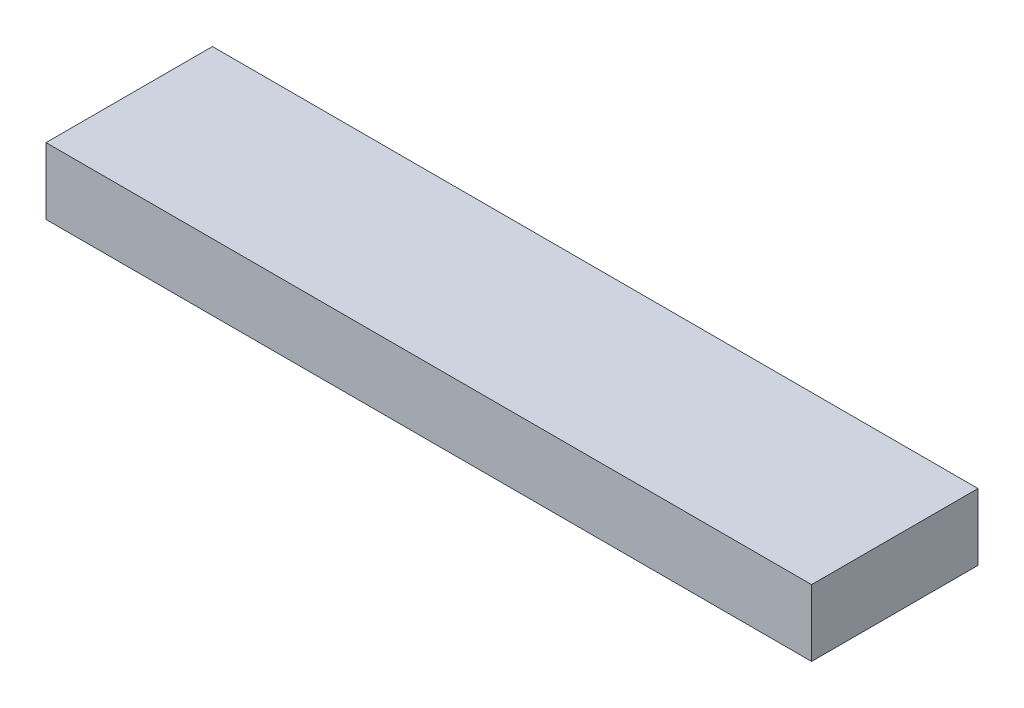
ISO-10303-21;
HEADER;
FILE_DESCRIPTION(('STEP AP214'),'2;1');
FILE_NAME('part.step','',(''),(''),'','','');
FILE_SCHEMA(('AUTOMOTIVE_DESIGN { 1 0 10303 214 1 1 1 1 }'));
ENDSEC;
DATA;
#1=APPLICATION_CONTEXT('core data for automotive mechanical design processes');
#2=APPLICATION_PROTOCOL_DEFINITION('international standard','automotive_design',2000,#1);
#3=PRODUCT_CONTEXT('',#1,'mechanical');
#4=PRODUCT('Part','Part','',(#3));
#5=PRODUCT_RELATED_PRODUCT_CATEGORY('part','',(#4));
#6=PRODUCT_DEFINITION_FORMATION('','',#4);
#7=PRODUCT_DEFINITION_CONTEXT('part definition',#1,'design');
#8=PRODUCT_DEFINITION('design','',#6,#7);
#9=PRODUCT_DEFINITION_SHAPE('','',#8);
#10=(LENGTH_UNIT() NAMED_UNIT(*) SI_UNIT(.MILLI.,.METRE.));
#11=(NAMED_UNIT(*) PLANE_ANGLE_UNIT() SI_UNIT($,.RADIAN.));
#12=(NAMED_UNIT(*) SI_UNIT($,.STERADIAN.) SOLID_ANGLE_UNIT());
#13=UNCERTAINTY_MEASURE_WITH_UNIT(LENGTH_MEASURE(1.E-05),#10,'distance_accuracy_value','');
#14=(GEOMETRIC_REPRESENTATION_CONTEXT(3) GLOBAL_UNCERTAINTY_ASSIGNED_CONTEXT((#13)) GLOBAL_UNIT_ASSIGNED_CONTEXT((#10,
#11,#12)) REPRESENTATION_CONTEXT('',''));
#15=CARTESIAN_POINT('',(0.,0.,0.));
#16=DIRECTION('',(0.,0.,1.));
#17=DIRECTION('',(1.,0.,0.));
#18=AXIS2_PLACEMENT_3D('',#15,#16,#17);
#19=CARTESIAN_POINT('',(0.,0.,31.75));
#20=DIRECTION('',(1.,0.,0.));
#21=DIRECTION('',(0.,1.,0.));
#22=AXIS2_PLACEMENT_3D('',#19,#20,#21);
#23=PLANE('',#22);
#24=DIRECTION('',(0.,-1.,0.));
#25=VECTOR('',#24,1.);
#26=CARTESIAN_POINT('',(0.,0.,0.));
#27=LINE('',#26,#25);
#28=CARTESIAN_POINT('',(0.,0.,0.));
#29=VERTEX_POINT('',#28);
#30=CARTESIAN_POINT('',(0.,-12.7,0.));
#31=VERTEX_POINT('',#30);
#32=EDGE_CURVE('E97',#29,#31,#27,.T.);
#33=ORIENTED_EDGE('',*,*,#32,.T.);
#34=DIRECTION('',(0.,0.,-1.));
#35=VECTOR('',#34,1.);
#36=CARTESIAN_POINT('',(0.,-12.7,31.75));
#37=LINE('',#36,#35);
#38=CARTESIAN_POINT('',(0.,-12.7,31.75));
#39=VERTEX_POINT('',#38);
#40=EDGE_CURVE('E11',#39,#31,#37,.T.);
#41=ORIENTED_EDGE('',*,*,#40,.F.);
#42=DIRECTION('',(0.,-1.,0.));
#43=VECTOR('',#42,1.);
#44=CARTESIAN_POINT('',(0.,0.,31.75));
#45=LINE('',#44,#43);
#46=CARTESIAN_POINT('',(0.,0.,31.75));
#47=VERTEX_POINT('',#46);
#48=EDGE_CURVE('E85',#47,#39,#45,.T.);
#49=ORIENTED_EDGE('',*,*,#48,.F.);
#50=DIRECTION('',(0.,0.,-1.));
#51=VECTOR('',#50,1.);
#52=CARTESIAN_POINT('',(0.,0.,31.75));
#53=LINE('',#52,#51);
#54=EDGE_CURVE('E93',#47,#29,#53,.T.);
#55=ORIENTED_EDGE('',*,*,#54,.T.);
#56=EDGE_LOOP('',(#33,#41,#49,#55));
#57=FACE_BOUND('',#56,.T.);
#58=ADVANCED_FACE('F34',(#57),#23,.F.);
#59=CARTESIAN_POINT('',(0.,-12.7,31.75));
#60=DIRECTION('',(0.,1.,0.));
#61=DIRECTION('',(0.,0.,1.));
#62=AXIS2_PLACEMENT_3D('',#59,#60,#61);
#63=PLANE('',#62);
#64=DIRECTION('',(1.,0.,0.));
#65=VECTOR('',#64,1.);
#66=CARTESIAN_POINT('',(0.,-12.7,0.));
#67=LINE('',#66,#65);
#68=CARTESIAN_POINT('',(146.05,-12.7,0.));
#69=VERTEX_POINT('',#68);
#70=EDGE_CURVE('E89',#31,#69,#67,.T.);
#71=ORIENTED_EDGE('',*,*,#70,.T.);
#72=DIRECTION('',(0.,0.,-1.));
#73=VECTOR('',#72,1.);
#74=CARTESIAN_POINT('',(146.05,-12.7,31.75));
#75=LINE('',#74,#73);
#76=CARTESIAN_POINT('',(146.05,-12.7,31.75));
#77=VERTEX_POINT('',#76);
#78=EDGE_CURVE('E42',#77,#69,#75,.T.);
#79=ORIENTED_EDGE('',*,*,#78,.F.);
#80=DIRECTION('',(1.,0.,0.));
#81=VECTOR('',#80,1.);
#82=CARTESIAN_POINT('',(0.,-12.7,31.75));
#83=LINE('',#82,#81);
#84=EDGE_CURVE('E80',#39,#77,#83,.T.);
#85=ORIENTED_EDGE('',*,*,#84,.F.);
#86=ORIENTED_EDGE('',*,*,#40,.T.);
#87=EDGE_LOOP('',(#71,#79,#85,#86));
#88=FACE_BOUND('',#87,.T.);
#89=ADVANCED_FACE('F88',(#88),#63,.F.);
#90=CARTESIAN_POINT('',(146.05,0.,31.75));
#91=DIRECTION('',(-1.,0.,0.));
#92=DIRECTION('',(0.,0.,1.));
#93=AXIS2_PLACEMENT_3D('',#90,#91,#92);
#94=PLANE('',#93);
#95=DIRECTION('',(0.,1.,0.));
#96=VECTOR('',#95,1.);
#97=CARTESIAN_POINT('',(146.05,0.,0.));
#98=LINE('',#97,#96);
#99=CARTESIAN_POINT('',(146.05,0.,0.));
#100=VERTEX_POINT('',#99);
#101=EDGE_CURVE('E67',#69,#100,#98,.T.);
#102=ORIENTED_EDGE('',*,*,#101,.T.);
#103=DIRECTION('',(0.,0.,-1.));
#104=VECTOR('',#103,1.);
#105=CARTESIAN_POINT('',(146.05,0.,31.75));
#106=LINE('',#105,#104);
#107=CARTESIAN_POINT('',(146.05,0.,31.75));
#108=VERTEX_POINT('',#107);
#109=EDGE_CURVE('E90',#108,#100,#106,.T.);
#110=ORIENTED_EDGE('',*,*,#109,.F.);
#111=DIRECTION('',(0.,1.,0.));
#112=VECTOR('',#111,1.);
#113=CARTESIAN_POINT('',(146.05,0.,31.75));
#114=LINE('',#113,#112);
#115=EDGE_CURVE('E83',#77,#108,#114,.T.);
#116=ORIENTED_EDGE('',*,*,#115,.F.);
#117=ORIENTED_EDGE('',*,*,#78,.T.);
#118=EDGE_LOOP('',(#102,#110,#116,#117));
#119=FACE_BOUND('',#118,.T.);
#120=ADVANCED_FACE('F91',(#119),#94,.F.);
#121=CARTESIAN_POINT('',(0.,0.,31.75));
#122=DIRECTION('',(0.,-1.,0.));
#123=DIRECTION('',(0.,0.,-1.));
#124=AXIS2_PLACEMENT_3D('',#121,#122,#123);
#125=PLANE('',#124);
#126=DIRECTION('',(-1.,0.,0.));
#127=VECTOR('',#126,1.);
#128=CARTESIAN_POINT('',(0.,0.,0.));
#129=LINE('',#128,#127);
#130=EDGE_CURVE('E73',#100,#29,#129,.T.);
#131=ORIENTED_EDGE('',*,*,#130,.T.);
#132=ORIENTED_EDGE('',*,*,#54,.F.);
#133=DIRECTION('',(-1.,0.,0.));
#134=VECTOR('',#133,1.);
#135=CARTESIAN_POINT('',(0.,0.,31.75));
#136=LINE('',#135,#134);
#137=EDGE_CURVE('E50',#108,#47,#136,.T.);
#138=ORIENTED_EDGE('',*,*,#137,.F.);
#139=ORIENTED_EDGE('',*,*,#109,.T.);
#140=EDGE_LOOP('',(#131,#132,#138,#139));
#141=FACE_BOUND('',#140,.T.);
#142=ADVANCED_FACE('F104',(#141),#125,.F.);
#143=CARTESIAN_POINT('',(0.,-12.7,31.75));
#144=DIRECTION('',(0.,0.,1.));
#145=DIRECTION('',(1.,0.,0.));
#146=AXIS2_PLACEMENT_3D('',#143,#144,#145);
#147=PLANE('',#146);
#148=ORIENTED_EDGE('',*,*,#48,.T.);
#149=ORIENTED_EDGE('',*,*,#84,.T.);
#150=ORIENTED_EDGE('',*,*,#115,.T.);
#151=ORIENTED_EDGE('',*,*,#137,.T.);
#152=EDGE_LOOP('',(#148,#149,#150,#151));
#153=FACE_BOUND('',#152,.T.);
#154=ADVANCED_FACE('F81',(#153),#147,.T.);
#155=CARTESIAN_POINT('',(0.,-12.7,0.));
#156=DIRECTION('',(0.,0.,1.));
#157=DIRECTION('',(1.,0.,0.));
#158=AXIS2_PLACEMENT_3D('',#155,#156,#157);
#159=PLANE('',#158);
#160=ORIENTED_EDGE('',*,*,#32,.F.);
#161=ORIENTED_EDGE('',*,*,#130,.F.);
#162=ORIENTED_EDGE('',*,*,#101,.F.);
#163=ORIENTED_EDGE('',*,*,#70,.F.);
#164=EDGE_LOOP('',(#160,#161,#162,#163));
#165=FACE_BOUND('',#164,.T.);
#166=ADVANCED_FACE('F107',(#165),#159,.F.);
#167=CLOSED_SHELL('',(#58,#89,#120,#142,#154,#166));
#168=MANIFOLD_SOLID_BREP('B2',#167);
#169=ADVANCED_BREP_SHAPE_REPRESENTATION('',(#18,#168),#14);
#170=SHAPE_DEFINITION_REPRESENTATION(#9,#169);
ENDSEC;
END-ISO-10303-21;
